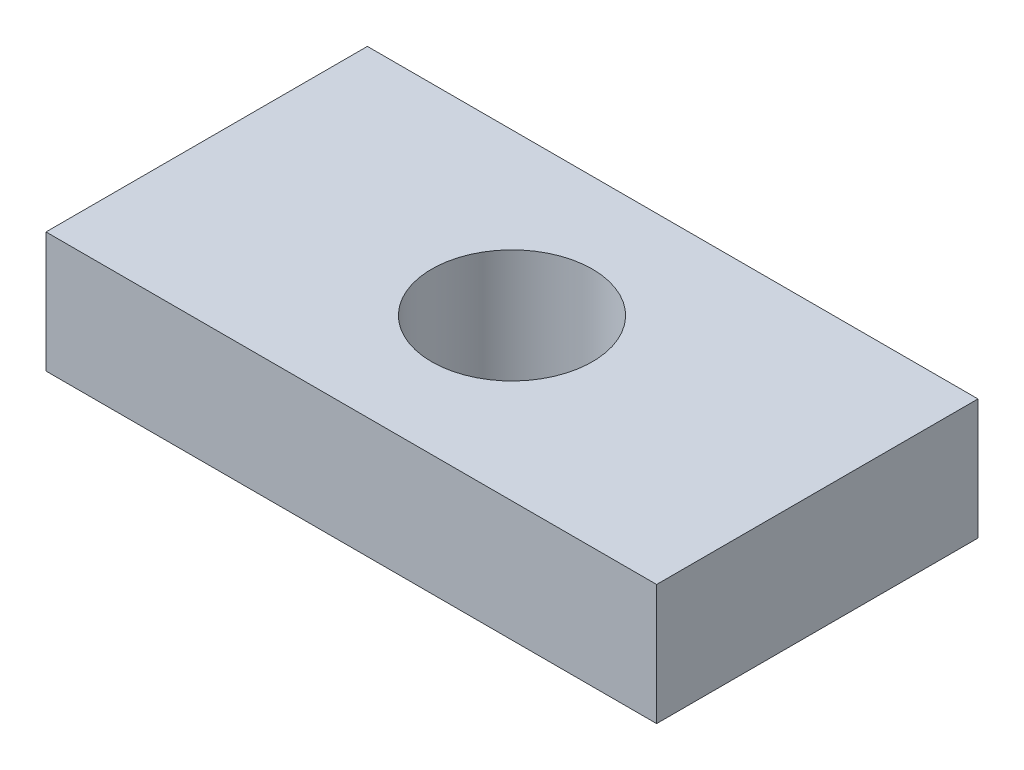
ISO-10303-21;
HEADER;
FILE_DESCRIPTION(('STEP AP214'),'2;1');
FILE_NAME('part.step','',(''),(''),'','','');
FILE_SCHEMA(('AUTOMOTIVE_DESIGN { 1 0 10303 214 1 1 1 1 }'));
ENDSEC;
DATA;
#1=APPLICATION_CONTEXT('core data for automotive mechanical design processes');
#2=APPLICATION_PROTOCOL_DEFINITION('international standard','automotive_design',2000,#1);
#3=PRODUCT_CONTEXT('',#1,'mechanical');
#4=PRODUCT('Part','Part','',(#3));
#5=PRODUCT_RELATED_PRODUCT_CATEGORY('part','',(#4));
#6=PRODUCT_DEFINITION_FORMATION('','',#4);
#7=PRODUCT_DEFINITION_CONTEXT('part definition',#1,'design');
#8=PRODUCT_DEFINITION('design','',#6,#7);
#9=PRODUCT_DEFINITION_SHAPE('','',#8);
#10=(LENGTH_UNIT() NAMED_UNIT(*) SI_UNIT(.MILLI.,.METRE.));
#11=(NAMED_UNIT(*) PLANE_ANGLE_UNIT() SI_UNIT($,.RADIAN.));
#12=(NAMED_UNIT(*) SI_UNIT($,.STERADIAN.) SOLID_ANGLE_UNIT());
#13=UNCERTAINTY_MEASURE_WITH_UNIT(LENGTH_MEASURE(1.E-05),#10,'distance_accuracy_value','');
#14=(GEOMETRIC_REPRESENTATION_CONTEXT(3) GLOBAL_UNCERTAINTY_ASSIGNED_CONTEXT((#13)) GLOBAL_UNIT_ASSIGNED_CONTEXT((#10,
#11,#12)) REPRESENTATION_CONTEXT('',''));
#15=CARTESIAN_POINT('',(0.,0.,0.));
#16=DIRECTION('',(0.,0.,1.));
#17=DIRECTION('',(1.,0.,0.));
#18=AXIS2_PLACEMENT_3D('',#15,#16,#17);
#19=CARTESIAN_POINT('',(0.,15.,0.));
#20=DIRECTION('',(0.,1.,0.));
#21=DIRECTION('',(0.,0.,1.));
#22=AXIS2_PLACEMENT_3D('',#19,#20,#21);
#23=PLANE('',#22);
#24=DIRECTION('',(0.,0.,-1.));
#25=VECTOR('',#24,1.);
#26=CARTESIAN_POINT('',(38.,15.,-20.));
#27=LINE('',#26,#25);
#28=CARTESIAN_POINT('',(38.,15.,20.));
#29=VERTEX_POINT('',#28);
#30=CARTESIAN_POINT('',(38.,15.,-20.));
#31=VERTEX_POINT('',#30);
#32=EDGE_CURVE('E85',#29,#31,#27,.T.);
#33=ORIENTED_EDGE('',*,*,#32,.T.);
#34=DIRECTION('',(-1.,0.,0.));
#35=VECTOR('',#34,1.);
#36=CARTESIAN_POINT('',(-38.,15.,-20.));
#37=LINE('',#36,#35);
#38=CARTESIAN_POINT('',(-38.,15.,-20.));
#39=VERTEX_POINT('',#38);
#40=EDGE_CURVE('E80',#31,#39,#37,.T.);
#41=ORIENTED_EDGE('',*,*,#40,.T.);
#42=DIRECTION('',(0.,0.,1.));
#43=VECTOR('',#42,1.);
#44=CARTESIAN_POINT('',(-38.,15.,-20.));
#45=LINE('',#44,#43);
#46=CARTESIAN_POINT('',(-38.,15.,20.));
#47=VERTEX_POINT('',#46);
#48=EDGE_CURVE('E83',#39,#47,#45,.T.);
#49=ORIENTED_EDGE('',*,*,#48,.T.);
#50=DIRECTION('',(1.,0.,0.));
#51=VECTOR('',#50,1.);
#52=CARTESIAN_POINT('',(-38.,15.,20.));
#53=LINE('',#52,#51);
#54=EDGE_CURVE('E50',#47,#29,#53,.T.);
#55=ORIENTED_EDGE('',*,*,#54,.T.);
#56=EDGE_LOOP('',(#33,#41,#49,#55));
#57=FACE_BOUND('',#56,.T.);
#58=CARTESIAN_POINT('',(0.,15.,0.));
#59=DIRECTION('',(0.,1.,0.));
#60=DIRECTION('',(0.,0.,1.));
#61=AXIS2_PLACEMENT_3D('',#58,#59,#60);
#62=CIRCLE('',#61,10.);
#63=CARTESIAN_POINT('',(0.,15.,9.99999999999999));
#64=VERTEX_POINT('',#63);
#65=EDGE_CURVE('E100',#64,#64,#62,.T.);
#66=ORIENTED_EDGE('',*,*,#65,.F.);
#67=EDGE_LOOP('',(#66));
#68=FACE_BOUND('',#67,.T.);
#69=ADVANCED_FACE('F33',(#57,#68),#23,.T.);
#70=CARTESIAN_POINT('',(0.,0.,0.));
#71=DIRECTION('',(0.,1.,0.));
#72=DIRECTION('',(0.,0.,1.));
#73=AXIS2_PLACEMENT_3D('',#70,#71,#72);
#74=PLANE('',#73);
#75=DIRECTION('',(0.,0.,-1.));
#76=VECTOR('',#75,1.);
#77=CARTESIAN_POINT('',(38.,0.,-20.));
#78=LINE('',#77,#76);
#79=CARTESIAN_POINT('',(38.,0.,20.));
#80=VERTEX_POINT('',#79);
#81=CARTESIAN_POINT('',(38.,0.,-20.));
#82=VERTEX_POINT('',#81);
#83=EDGE_CURVE('E97',#80,#82,#78,.T.);
#84=ORIENTED_EDGE('',*,*,#83,.F.);
#85=DIRECTION('',(1.,0.,0.));
#86=VECTOR('',#85,1.);
#87=CARTESIAN_POINT('',(-38.,0.,20.));
#88=LINE('',#87,#86);
#89=CARTESIAN_POINT('',(-38.,0.,20.));
#90=VERTEX_POINT('',#89);
#91=EDGE_CURVE('E73',#90,#80,#88,.T.);
#92=ORIENTED_EDGE('',*,*,#91,.F.);
#93=DIRECTION('',(0.,0.,1.));
#94=VECTOR('',#93,1.);
#95=CARTESIAN_POINT('',(-38.,0.,-20.));
#96=LINE('',#95,#94);
#97=CARTESIAN_POINT('',(-38.,0.,-20.));
#98=VERTEX_POINT('',#97);
#99=EDGE_CURVE('E67',#98,#90,#96,.T.);
#100=ORIENTED_EDGE('',*,*,#99,.F.);
#101=DIRECTION('',(-1.,0.,0.));
#102=VECTOR('',#101,1.);
#103=CARTESIAN_POINT('',(-38.,0.,-20.));
#104=LINE('',#103,#102);
#105=EDGE_CURVE('E89',#82,#98,#104,.T.);
#106=ORIENTED_EDGE('',*,*,#105,.F.);
#107=EDGE_LOOP('',(#84,#92,#100,#106));
#108=FACE_BOUND('',#107,.T.);
#109=CARTESIAN_POINT('',(0.,0.,0.));
#110=DIRECTION('',(0.,1.,0.));
#111=DIRECTION('',(0.,0.,1.));
#112=AXIS2_PLACEMENT_3D('',#109,#110,#111);
#113=CIRCLE('',#112,10.);
#114=CARTESIAN_POINT('',(0.,0.,9.99999999999999));
#115=VERTEX_POINT('',#114);
#116=EDGE_CURVE('E112',#115,#115,#113,.T.);
#117=ORIENTED_EDGE('',*,*,#116,.T.);
#118=EDGE_LOOP('',(#117));
#119=FACE_BOUND('',#118,.T.);
#120=ADVANCED_FACE('F108',(#108,#119),#74,.F.);
#121=CARTESIAN_POINT('',(38.,15.,-20.));
#122=DIRECTION('',(-1.,0.,0.));
#123=DIRECTION('',(0.,0.,1.));
#124=AXIS2_PLACEMENT_3D('',#121,#122,#123);
#125=PLANE('',#124);
#126=ORIENTED_EDGE('',*,*,#83,.T.);
#127=DIRECTION('',(0.,-1.,0.));
#128=VECTOR('',#127,1.);
#129=CARTESIAN_POINT('',(38.,15.,-20.));
#130=LINE('',#129,#128);
#131=EDGE_CURVE('E11',#31,#82,#130,.T.);
#132=ORIENTED_EDGE('',*,*,#131,.F.);
#133=ORIENTED_EDGE('',*,*,#32,.F.);
#134=DIRECTION('',(0.,-1.,0.));
#135=VECTOR('',#134,1.);
#136=CARTESIAN_POINT('',(38.,15.,20.));
#137=LINE('',#136,#135);
#138=EDGE_CURVE('E93',#29,#80,#137,.T.);
#139=ORIENTED_EDGE('',*,*,#138,.T.);
#140=EDGE_LOOP('',(#126,#132,#133,#139));
#141=FACE_BOUND('',#140,.T.);
#142=ADVANCED_FACE('F35',(#141),#125,.F.);
#143=CARTESIAN_POINT('',(-38.,15.,-20.));
#144=DIRECTION('',(0.,0.,1.));
#145=DIRECTION('',(1.,0.,0.));
#146=AXIS2_PLACEMENT_3D('',#143,#144,#145);
#147=PLANE('',#146);
#148=ORIENTED_EDGE('',*,*,#105,.T.);
#149=DIRECTION('',(0.,-1.,0.));
#150=VECTOR('',#149,1.);
#151=CARTESIAN_POINT('',(-38.,15.,-20.));
#152=LINE('',#151,#150);
#153=EDGE_CURVE('E42',#39,#98,#152,.T.);
#154=ORIENTED_EDGE('',*,*,#153,.F.);
#155=ORIENTED_EDGE('',*,*,#40,.F.);
#156=ORIENTED_EDGE('',*,*,#131,.T.);
#157=EDGE_LOOP('',(#148,#154,#155,#156));
#158=FACE_BOUND('',#157,.T.);
#159=ADVANCED_FACE('F88',(#158),#147,.F.);
#160=CARTESIAN_POINT('',(-38.,15.,-20.));
#161=DIRECTION('',(1.,0.,0.));
#162=DIRECTION('',(0.,0.,-1.));
#163=AXIS2_PLACEMENT_3D('',#160,#161,#162);
#164=PLANE('',#163);
#165=ORIENTED_EDGE('',*,*,#99,.T.);
#166=DIRECTION('',(0.,-1.,0.));
#167=VECTOR('',#166,1.);
#168=CARTESIAN_POINT('',(-38.,15.,20.));
#169=LINE('',#168,#167);
#170=EDGE_CURVE('E90',#47,#90,#169,.T.);
#171=ORIENTED_EDGE('',*,*,#170,.F.);
#172=ORIENTED_EDGE('',*,*,#48,.F.);
#173=ORIENTED_EDGE('',*,*,#153,.T.);
#174=EDGE_LOOP('',(#165,#171,#172,#173));
#175=FACE_BOUND('',#174,.T.);
#176=ADVANCED_FACE('F91',(#175),#164,.F.);
#177=CARTESIAN_POINT('',(-38.,15.,20.));
#178=DIRECTION('',(0.,0.,-1.));
#179=DIRECTION('',(-1.,0.,0.));
#180=AXIS2_PLACEMENT_3D('',#177,#178,#179);
#181=PLANE('',#180);
#182=ORIENTED_EDGE('',*,*,#91,.T.);
#183=ORIENTED_EDGE('',*,*,#138,.F.);
#184=ORIENTED_EDGE('',*,*,#54,.F.);
#185=ORIENTED_EDGE('',*,*,#170,.T.);
#186=EDGE_LOOP('',(#182,#183,#184,#185));
#187=FACE_BOUND('',#186,.T.);
#188=ADVANCED_FACE('F105',(#187),#181,.F.);
#189=CARTESIAN_POINT('',(0.,15.,0.));
#190=DIRECTION('',(0.,-1.,0.));
#191=DIRECTION('',(0.,0.,-1.));
#192=AXIS2_PLACEMENT_3D('',#189,#190,#191);
#193=CYLINDRICAL_SURFACE('',#192,10.);
#194=ORIENTED_EDGE('',*,*,#65,.T.);
#195=EDGE_LOOP('',(#194));
#196=FACE_BOUND('',#195,.T.);
#197=ORIENTED_EDGE('',*,*,#116,.F.);
#198=EDGE_LOOP('',(#197));
#199=FACE_BOUND('',#198,.T.);
#200=ADVANCED_FACE('F118',(#196,#199),#193,.F.);
#201=CLOSED_SHELL('',(#69,#120,#142,#159,#176,#188,#200));
#202=MANIFOLD_SOLID_BREP('B2',#201);
#203=ADVANCED_BREP_SHAPE_REPRESENTATION('',(#18,#202),#14);
#204=SHAPE_DEFINITION_REPRESENTATION(#9,#203);
ENDSEC;
END-ISO-10303-21;
